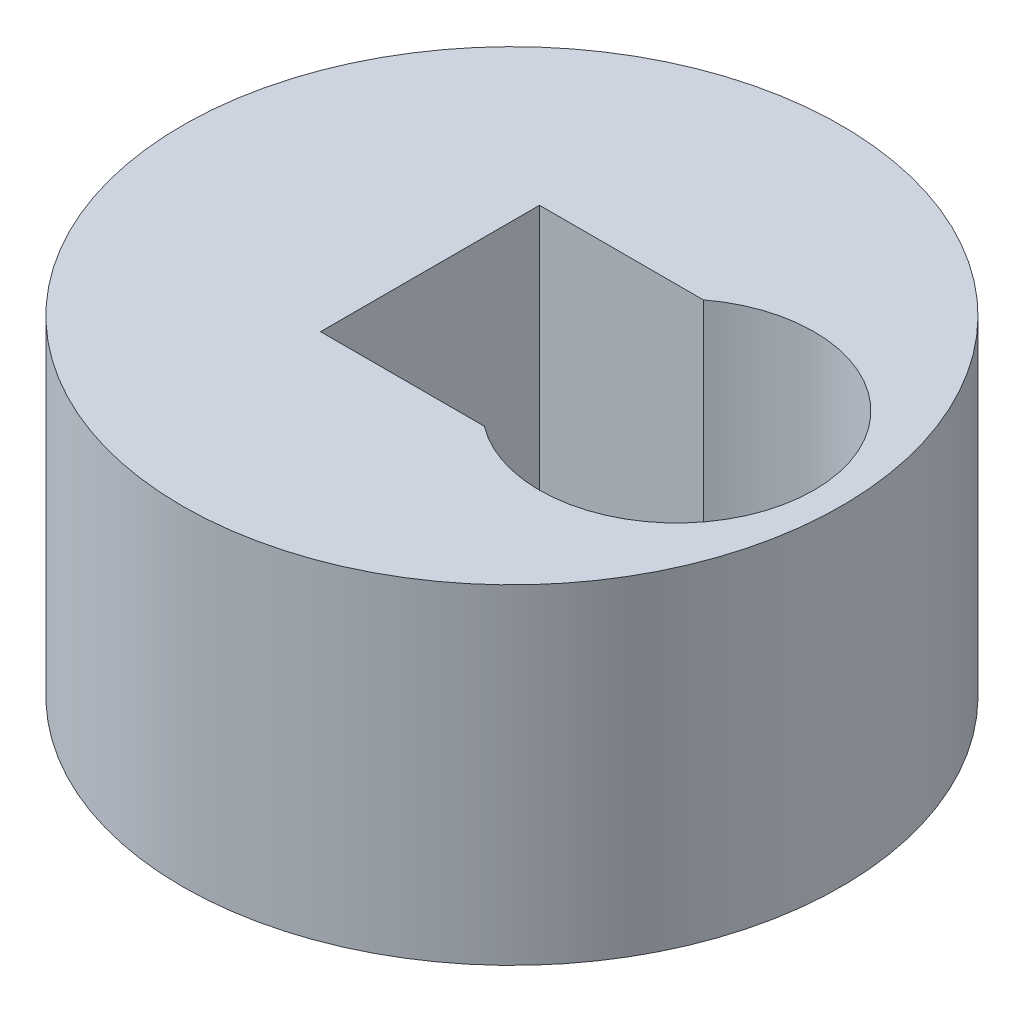
ISO-10303-21;
HEADER;
FILE_DESCRIPTION(('STEP AP214'),'2;1');
FILE_NAME('part.step','',(''),(''),'','','');
FILE_SCHEMA(('AUTOMOTIVE_DESIGN { 1 0 10303 214 1 1 1 1 }'));
ENDSEC;
DATA;
#1=APPLICATION_CONTEXT('core data for automotive mechanical design processes');
#2=APPLICATION_PROTOCOL_DEFINITION('international standard','automotive_design',2000,#1);
#3=PRODUCT_CONTEXT('',#1,'mechanical');
#4=PRODUCT('Part','Part','',(#3));
#5=PRODUCT_RELATED_PRODUCT_CATEGORY('part','',(#4));
#6=PRODUCT_DEFINITION_FORMATION('','',#4);
#7=PRODUCT_DEFINITION_CONTEXT('part definition',#1,'design');
#8=PRODUCT_DEFINITION('design','',#6,#7);
#9=PRODUCT_DEFINITION_SHAPE('','',#8);
#10=(LENGTH_UNIT() NAMED_UNIT(*) SI_UNIT(.MILLI.,.METRE.));
#11=(NAMED_UNIT(*) PLANE_ANGLE_UNIT() SI_UNIT($,.RADIAN.));
#12=(NAMED_UNIT(*) SI_UNIT($,.STERADIAN.) SOLID_ANGLE_UNIT());
#13=UNCERTAINTY_MEASURE_WITH_UNIT(LENGTH_MEASURE(1.E-05),#10,'distance_accuracy_value','');
#14=(GEOMETRIC_REPRESENTATION_CONTEXT(3) GLOBAL_UNCERTAINTY_ASSIGNED_CONTEXT((#13)) GLOBAL_UNIT_ASSIGNED_CONTEXT((#10,
#11,#12)) REPRESENTATION_CONTEXT('',''));
#15=CARTESIAN_POINT('',(0.,0.,0.));
#16=DIRECTION('',(0.,0.,1.));
#17=DIRECTION('',(1.,0.,0.));
#18=AXIS2_PLACEMENT_3D('',#15,#16,#17);
#19=CARTESIAN_POINT('',(0.,6.,0.));
#20=DIRECTION('',(0.,1.,0.));
#21=DIRECTION('',(0.,0.,1.));
#22=AXIS2_PLACEMENT_3D('',#19,#20,#21);
#23=PLANE('',#22);
#24=DIRECTION('',(1.,0.,0.));
#25=VECTOR('',#24,1.);
#26=CARTESIAN_POINT('',(-1.4909388792005,6.,1.99317197795156));
#27=LINE('',#26,#25);
#28=CARTESIAN_POINT('',(-1.4909388792005,6.,1.99317197795156));
#29=VERTEX_POINT('',#28);
#30=CARTESIAN_POINT('',(1.4909388792005,6.,1.99317197795156));
#31=VERTEX_POINT('',#30);
#32=EDGE_CURVE('E120',#29,#31,#27,.T.);
#33=ORIENTED_EDGE('',*,*,#32,.F.);
#34=DIRECTION('',(0.,0.,1.));
#35=VECTOR('',#34,1.);
#36=CARTESIAN_POINT('',(-1.4909388792005,6.,-1.99317197795156));
#37=LINE('',#36,#35);
#38=CARTESIAN_POINT('',(-1.4909388792005,6.,-1.99317197795156));
#39=VERTEX_POINT('',#38);
#40=EDGE_CURVE('E92',#39,#29,#37,.T.);
#41=ORIENTED_EDGE('',*,*,#40,.F.);
#42=DIRECTION('',(-1.,0.,0.));
#43=VECTOR('',#42,1.);
#44=CARTESIAN_POINT('',(-1.4909388792005,6.,-1.99317197795156));
#45=LINE('',#44,#43);
#46=CARTESIAN_POINT('',(1.4909388792005,6.,-1.99317197795156));
#47=VERTEX_POINT('',#46);
#48=EDGE_CURVE('E78',#47,#39,#45,.T.);
#49=ORIENTED_EDGE('',*,*,#48,.F.);
#50=CARTESIAN_POINT('',(3.,6.,0.));
#51=DIRECTION('',(0.,1.,0.));
#52=DIRECTION('',(0.,0.,1.));
#53=AXIS2_PLACEMENT_3D('',#50,#51,#52);
#54=CIRCLE('',#53,2.5);
#55=EDGE_CURVE('E90',#31,#47,#54,.T.);
#56=ORIENTED_EDGE('',*,*,#55,.F.);
#57=EDGE_LOOP('',(#33,#41,#49,#56));
#58=FACE_BOUND('',#57,.T.);
#59=CARTESIAN_POINT('',(0.,6.,0.));
#60=DIRECTION('',(0.,1.,0.));
#61=DIRECTION('',(0.,0.,1.));
#62=AXIS2_PLACEMENT_3D('',#59,#60,#61);
#63=CIRCLE('',#62,6.);
#64=CARTESIAN_POINT('',(0.,6.,6.));
#65=VERTEX_POINT('',#64);
#66=EDGE_CURVE('E84',#65,#65,#63,.T.);
#67=ORIENTED_EDGE('',*,*,#66,.T.);
#68=EDGE_LOOP('',(#67));
#69=FACE_BOUND('',#68,.T.);
#70=ADVANCED_FACE('F36',(#58,#69),#23,.T.);
#71=CARTESIAN_POINT('',(0.,0.,0.));
#72=DIRECTION('',(0.,1.,0.));
#73=DIRECTION('',(0.,0.,1.));
#74=AXIS2_PLACEMENT_3D('',#71,#72,#73);
#75=PLANE('',#74);
#76=CARTESIAN_POINT('',(0.,0.,0.));
#77=DIRECTION('',(0.,1.,0.));
#78=DIRECTION('',(0.,0.,1.));
#79=AXIS2_PLACEMENT_3D('',#76,#77,#78);
#80=CIRCLE('',#79,6.);
#81=CARTESIAN_POINT('',(0.,0.,6.));
#82=VERTEX_POINT('',#81);
#83=EDGE_CURVE('E95',#82,#82,#80,.T.);
#84=ORIENTED_EDGE('',*,*,#83,.F.);
#85=EDGE_LOOP('',(#84));
#86=FACE_BOUND('',#85,.T.);
#87=DIRECTION('',(0.,0.,1.));
#88=VECTOR('',#87,1.);
#89=CARTESIAN_POINT('',(-1.4909388792005,0.,0.));
#90=LINE('',#89,#88);
#91=CARTESIAN_POINT('',(-1.4909388792005,0.,-1.99317197795156));
#92=VERTEX_POINT('',#91);
#93=CARTESIAN_POINT('',(-1.4909388792005,0.,1.99317197795156));
#94=VERTEX_POINT('',#93);
#95=EDGE_CURVE('E11',#92,#94,#90,.T.);
#96=ORIENTED_EDGE('',*,*,#95,.T.);
#97=DIRECTION('',(1.,0.,0.));
#98=VECTOR('',#97,1.);
#99=CARTESIAN_POINT('',(0.,0.,1.99317197795156));
#100=LINE('',#99,#98);
#101=CARTESIAN_POINT('',(1.4909388792005,0.,1.99317197795156));
#102=VERTEX_POINT('',#101);
#103=EDGE_CURVE('E100',#94,#102,#100,.T.);
#104=ORIENTED_EDGE('',*,*,#103,.T.);
#105=CARTESIAN_POINT('',(3.,0.,0.));
#106=DIRECTION('',(0.,1.,0.));
#107=DIRECTION('',(0.,0.,1.));
#108=AXIS2_PLACEMENT_3D('',#105,#106,#107);
#109=CIRCLE('',#108,2.5);
#110=CARTESIAN_POINT('',(1.4909388792005,0.,-1.99317197795156));
#111=VERTEX_POINT('',#110);
#112=EDGE_CURVE('E96',#102,#111,#109,.T.);
#113=ORIENTED_EDGE('',*,*,#112,.T.);
#114=DIRECTION('',(-1.,0.,0.));
#115=VECTOR('',#114,1.);
#116=CARTESIAN_POINT('',(0.,0.,-1.99317197795156));
#117=LINE('',#116,#115);
#118=EDGE_CURVE('E51',#111,#92,#117,.T.);
#119=ORIENTED_EDGE('',*,*,#118,.T.);
#120=EDGE_LOOP('',(#96,#104,#113,#119));
#121=FACE_BOUND('',#120,.T.);
#122=ADVANCED_FACE('F110',(#86,#121),#75,.F.);
#123=CARTESIAN_POINT('',(0.,6.,0.));
#124=DIRECTION('',(0.,-1.,0.));
#125=DIRECTION('',(0.,0.,-1.));
#126=AXIS2_PLACEMENT_3D('',#123,#124,#125);
#127=CYLINDRICAL_SURFACE('',#126,6.);
#128=ORIENTED_EDGE('',*,*,#66,.F.);
#129=EDGE_LOOP('',(#128));
#130=FACE_BOUND('',#129,.T.);
#131=ORIENTED_EDGE('',*,*,#83,.T.);
#132=EDGE_LOOP('',(#131));
#133=FACE_BOUND('',#132,.T.);
#134=ADVANCED_FACE('F38',(#130,#133),#127,.T.);
#135=CARTESIAN_POINT('',(3.,6.,0.));
#136=DIRECTION('',(0.,-1.,0.));
#137=DIRECTION('',(0.,0.,-1.));
#138=AXIS2_PLACEMENT_3D('',#135,#136,#137);
#139=CYLINDRICAL_SURFACE('',#138,2.5);
#140=DIRECTION('',(0.,-1.,0.));
#141=VECTOR('',#140,1.);
#142=CARTESIAN_POINT('',(1.4909388792005,6.,1.99317197795156));
#143=LINE('',#142,#141);
#144=EDGE_CURVE('E44',#31,#102,#143,.T.);
#145=ORIENTED_EDGE('',*,*,#144,.F.);
#146=ORIENTED_EDGE('',*,*,#55,.T.);
#147=DIRECTION('',(0.,-1.,0.));
#148=VECTOR('',#147,1.);
#149=CARTESIAN_POINT('',(1.4909388792005,6.,-1.99317197795156));
#150=LINE('',#149,#148);
#151=EDGE_CURVE('E75',#111,#47,#150,.F.);
#152=ORIENTED_EDGE('',*,*,#151,.F.);
#153=ORIENTED_EDGE('',*,*,#112,.F.);
#154=EDGE_LOOP('',(#145,#146,#152,#153));
#155=FACE_BOUND('',#154,.T.);
#156=ADVANCED_FACE('F94',(#155),#139,.F.);
#157=CARTESIAN_POINT('',(-1.4909388792005,-4.,-1.99317197795156));
#158=DIRECTION('',(-1.,0.,0.));
#159=DIRECTION('',(0.,0.,1.));
#160=AXIS2_PLACEMENT_3D('',#157,#158,#159);
#161=PLANE('',#160);
#162=DIRECTION('',(0.,1.,0.));
#163=VECTOR('',#162,1.);
#164=CARTESIAN_POINT('',(-1.4909388792005,-4.,-1.99317197795156));
#165=LINE('',#164,#163);
#166=EDGE_CURVE('E118',#92,#39,#165,.T.);
#167=ORIENTED_EDGE('',*,*,#166,.T.);
#168=ORIENTED_EDGE('',*,*,#40,.T.);
#169=DIRECTION('',(0.,1.,0.));
#170=VECTOR('',#169,1.);
#171=CARTESIAN_POINT('',(-1.4909388792005,-4.,1.99317197795156));
#172=LINE('',#171,#170);
#173=EDGE_CURVE('E119',#94,#29,#172,.T.);
#174=ORIENTED_EDGE('',*,*,#173,.F.);
#175=ORIENTED_EDGE('',*,*,#95,.F.);
#176=EDGE_LOOP('',(#167,#168,#174,#175));
#177=FACE_BOUND('',#176,.T.);
#178=ADVANCED_FACE('F117',(#177),#161,.F.);
#179=CARTESIAN_POINT('',(-1.4909388792005,-4.,1.99317197795156));
#180=DIRECTION('',(0.,0.,1.));
#181=DIRECTION('',(1.,0.,0.));
#182=AXIS2_PLACEMENT_3D('',#179,#180,#181);
#183=PLANE('',#182);
#184=ORIENTED_EDGE('',*,*,#173,.T.);
#185=ORIENTED_EDGE('',*,*,#32,.T.);
#186=ORIENTED_EDGE('',*,*,#144,.T.);
#187=ORIENTED_EDGE('',*,*,#103,.F.);
#188=EDGE_LOOP('',(#184,#185,#186,#187));
#189=FACE_BOUND('',#188,.T.);
#190=ADVANCED_FACE('F125',(#189),#183,.F.);
#191=CARTESIAN_POINT('',(-1.4909388792005,-4.,-1.99317197795156));
#192=DIRECTION('',(0.,0.,-1.));
#193=DIRECTION('',(-1.,0.,0.));
#194=AXIS2_PLACEMENT_3D('',#191,#192,#193);
#195=PLANE('',#194);
#196=ORIENTED_EDGE('',*,*,#151,.T.);
#197=ORIENTED_EDGE('',*,*,#48,.T.);
#198=ORIENTED_EDGE('',*,*,#166,.F.);
#199=ORIENTED_EDGE('',*,*,#118,.F.);
#200=EDGE_LOOP('',(#196,#197,#198,#199));
#201=FACE_BOUND('',#200,.T.);
#202=ADVANCED_FACE('F77',(#201),#195,.F.);
#203=CLOSED_SHELL('',(#70,#122,#134,#156,#178,#190,#202));
#204=MANIFOLD_SOLID_BREP('B2',#203);
#205=ADVANCED_BREP_SHAPE_REPRESENTATION('',(#18,#204),#14);
#206=SHAPE_DEFINITION_REPRESENTATION(#9,#205);
ENDSEC;
END-ISO-10303-21;
